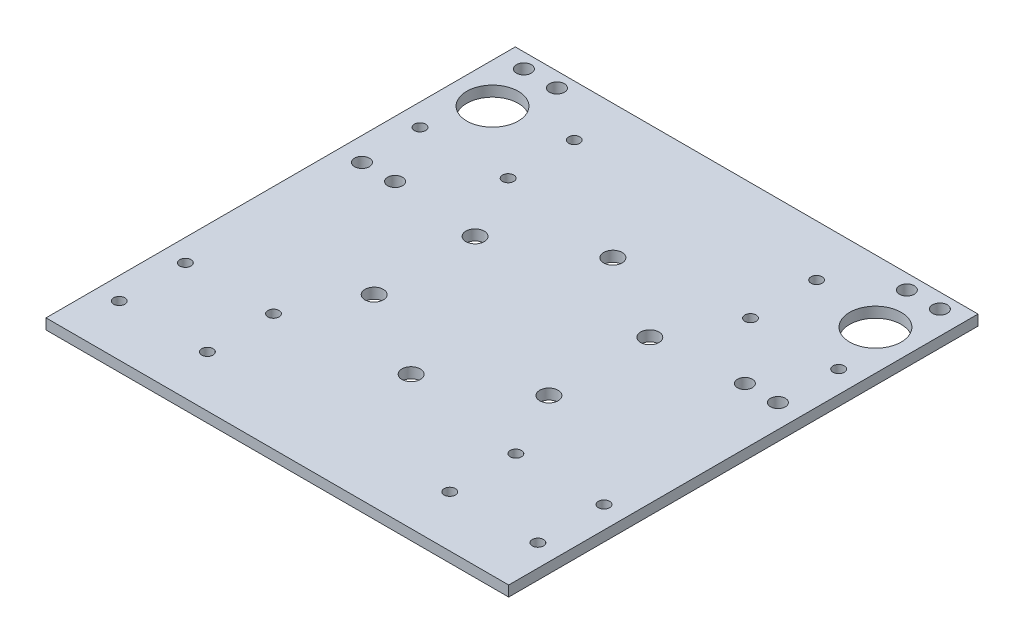
ISO-10303-21;
HEADER;
FILE_DESCRIPTION(('STEP AP214'),'2;1');
FILE_NAME('part.step','',(''),(''),'','','');
FILE_SCHEMA(('AUTOMOTIVE_DESIGN { 1 0 10303 214 1 1 1 1 }'));
ENDSEC;
DATA;
#1=APPLICATION_CONTEXT('core data for automotive mechanical design processes');
#2=APPLICATION_PROTOCOL_DEFINITION('international standard','automotive_design',2000,#1);
#3=PRODUCT_CONTEXT('',#1,'mechanical');
#4=PRODUCT('Part','Part','',(#3));
#5=PRODUCT_RELATED_PRODUCT_CATEGORY('part','',(#4));
#6=PRODUCT_DEFINITION_FORMATION('','',#4);
#7=PRODUCT_DEFINITION_CONTEXT('part definition',#1,'design');
#8=PRODUCT_DEFINITION('design','',#6,#7);
#9=PRODUCT_DEFINITION_SHAPE('','',#8);
#10=(LENGTH_UNIT() NAMED_UNIT(*) SI_UNIT(.MILLI.,.METRE.));
#11=(NAMED_UNIT(*) PLANE_ANGLE_UNIT() SI_UNIT($,.RADIAN.));
#12=(NAMED_UNIT(*) SI_UNIT($,.STERADIAN.) SOLID_ANGLE_UNIT());
#13=UNCERTAINTY_MEASURE_WITH_UNIT(LENGTH_MEASURE(1.E-05),#10,'distance_accuracy_value','');
#14=(GEOMETRIC_REPRESENTATION_CONTEXT(3) GLOBAL_UNCERTAINTY_ASSIGNED_CONTEXT((#13)) GLOBAL_UNIT_ASSIGNED_CONTEXT((#10,
#11,#12)) REPRESENTATION_CONTEXT('',''));
#15=CARTESIAN_POINT('',(0.,0.,0.));
#16=DIRECTION('',(0.,0.,1.));
#17=DIRECTION('',(1.,0.,0.));
#18=AXIS2_PLACEMENT_3D('',#15,#16,#17);
#19=CARTESIAN_POINT('',(0.,3.175,0.));
#20=DIRECTION('',(0.,-1.,0.));
#21=DIRECTION('',(0.,0.,-1.));
#22=AXIS2_PLACEMENT_3D('',#19,#20,#21);
#23=PLANE('',#22);
#24=CARTESIAN_POINT('',(-4.73926453636864E-12,3.175,30.525));
#25=DIRECTION('',(0.,1.,0.));
#26=DIRECTION('',(0.,0.,1.));
#27=AXIS2_PLACEMENT_3D('',#24,#25,#26);
#28=CIRCLE('',#27,2.778125);
#29=CARTESIAN_POINT('',(-4.73926453636864E-12,3.175,33.303125));
#30=VERTEX_POINT('',#29);
#31=EDGE_CURVE('E272',#30,#30,#28,.T.);
#32=ORIENTED_EDGE('',*,*,#31,.F.);
#33=EDGE_LOOP('',(#32));
#34=FACE_BOUND('',#33,.T.);
#35=CARTESIAN_POINT('',(26.4354254505184,3.175,15.2625000000027));
#36=DIRECTION('',(0.,1.,0.));
#37=DIRECTION('',(0.,0.,1.));
#38=AXIS2_PLACEMENT_3D('',#35,#36,#37);
#39=CIRCLE('',#38,2.778125);
#40=CARTESIAN_POINT('',(26.4354254505184,3.175,18.0406250000027));
#41=VERTEX_POINT('',#40);
#42=EDGE_CURVE('E279',#41,#41,#39,.T.);
#43=ORIENTED_EDGE('',*,*,#42,.F.);
#44=EDGE_LOOP('',(#43));
#45=FACE_BOUND('',#44,.T.);
#46=CARTESIAN_POINT('',(-26.4354254505232,3.175,15.2624999999945));
#47=DIRECTION('',(0.,1.,0.));
#48=DIRECTION('',(0.,0.,1.));
#49=AXIS2_PLACEMENT_3D('',#46,#47,#48);
#50=CIRCLE('',#49,2.778125);
#51=CARTESIAN_POINT('',(-26.4354254505232,3.175,18.0406249999945));
#52=VERTEX_POINT('',#51);
#53=EDGE_CURVE('E285',#52,#52,#50,.T.);
#54=ORIENTED_EDGE('',*,*,#53,.F.);
#55=EDGE_LOOP('',(#54));
#56=FACE_BOUND('',#55,.T.);
#57=CARTESIAN_POINT('',(26.4354254505208,3.175,-15.2624999999986));
#58=DIRECTION('',(0.,1.,0.));
#59=DIRECTION('',(0.,0.,1.));
#60=AXIS2_PLACEMENT_3D('',#57,#58,#59);
#61=CIRCLE('',#60,2.778125);
#62=CARTESIAN_POINT('',(26.4354254505208,3.175,-12.4843749999986));
#63=VERTEX_POINT('',#62);
#64=EDGE_CURVE('E291',#63,#63,#61,.T.);
#65=ORIENTED_EDGE('',*,*,#64,.F.);
#66=EDGE_LOOP('',(#65));
#67=FACE_BOUND('',#66,.T.);
#68=CARTESIAN_POINT('',(0.,3.175,-30.525));
#69=DIRECTION('',(0.,1.,0.));
#70=DIRECTION('',(0.,0.,1.));
#71=AXIS2_PLACEMENT_3D('',#68,#69,#70);
#72=CIRCLE('',#71,2.778125);
#73=CARTESIAN_POINT('',(0.,3.175,-27.746875));
#74=VERTEX_POINT('',#73);
#75=EDGE_CURVE('E271',#74,#74,#72,.T.);
#76=ORIENTED_EDGE('',*,*,#75,.F.);
#77=EDGE_LOOP('',(#76));
#78=FACE_BOUND('',#77,.T.);
#79=CARTESIAN_POINT('',(-26.435425450516,3.175,-15.2625000000069));
#80=DIRECTION('',(0.,1.,0.));
#81=DIRECTION('',(0.,0.,1.));
#82=AXIS2_PLACEMENT_3D('',#79,#80,#81);
#83=CIRCLE('',#82,2.778125);
#84=CARTESIAN_POINT('',(-26.435425450516,3.175,-12.4843750000069));
#85=VERTEX_POINT('',#84);
#86=EDGE_CURVE('E268',#85,#85,#83,.T.);
#87=ORIENTED_EDGE('',*,*,#86,.F.);
#88=EDGE_LOOP('',(#87));
#89=FACE_BOUND('',#88,.T.);
#90=CARTESIAN_POINT('',(62.9286,3.175,-17.5357));
#91=DIRECTION('',(0.,1.,0.));
#92=DIRECTION('',(0.,0.,1.));
#93=AXIS2_PLACEMENT_3D('',#90,#91,#92);
#94=CIRCLE('',#93,2.25);
#95=CARTESIAN_POINT('',(62.9286,3.175,-15.2857));
#96=VERTEX_POINT('',#95);
#97=EDGE_CURVE('E207',#96,#96,#94,.T.);
#98=ORIENTED_EDGE('',*,*,#97,.F.);
#99=EDGE_LOOP('',(#98));
#100=FACE_BOUND('',#99,.T.);
#101=CARTESIAN_POINT('',(36.6666666666667,3.175,-35.5));
#102=DIRECTION('',(0.,1.,0.));
#103=DIRECTION('',(0.,0.,1.));
#104=AXIS2_PLACEMENT_3D('',#101,#102,#103);
#105=CIRCLE('',#104,1.7);
#106=CARTESIAN_POINT('',(36.6666666666667,3.175,-33.8));
#107=VERTEX_POINT('',#106);
#108=EDGE_CURVE('E195',#107,#107,#105,.T.);
#109=ORIENTED_EDGE('',*,*,#108,.F.);
#110=EDGE_LOOP('',(#109));
#111=FACE_BOUND('',#110,.T.);
#112=CARTESIAN_POINT('',(-57.9286,3.175,-52.0357));
#113=DIRECTION('',(0.,1.,0.));
#114=DIRECTION('',(0.,0.,1.));
#115=AXIS2_PLACEMENT_3D('',#112,#113,#114);
#116=CIRCLE('',#115,7.8);
#117=CARTESIAN_POINT('',(-57.9286,3.175,-44.2357));
#118=VERTEX_POINT('',#117);
#119=EDGE_CURVE('E135',#118,#118,#116,.T.);
#120=ORIENTED_EDGE('',*,*,#119,.F.);
#121=EDGE_LOOP('',(#120));
#122=FACE_BOUND('',#121,.T.);
#123=CARTESIAN_POINT('',(-36.6666666666667,3.175,-55.5));
#124=DIRECTION('',(0.,1.,0.));
#125=DIRECTION('',(0.,0.,1.));
#126=AXIS2_PLACEMENT_3D('',#123,#124,#125);
#127=CIRCLE('',#126,1.7);
#128=CARTESIAN_POINT('',(-36.6666666666667,3.175,-53.8));
#129=VERTEX_POINT('',#128);
#130=EDGE_CURVE('E128',#129,#129,#127,.T.);
#131=ORIENTED_EDGE('',*,*,#130,.F.);
#132=EDGE_LOOP('',(#131));
#133=FACE_BOUND('',#132,.T.);
#134=CARTESIAN_POINT('',(52.9286,3.175,-66.5357));
#135=DIRECTION('',(0.,1.,0.));
#136=DIRECTION('',(0.,0.,1.));
#137=AXIS2_PLACEMENT_3D('',#134,#135,#136);
#138=CIRCLE('',#137,2.25);
#139=CARTESIAN_POINT('',(52.9286,3.175,-64.2857));
#140=VERTEX_POINT('',#139);
#141=EDGE_CURVE('E164',#140,#140,#138,.T.);
#142=ORIENTED_EDGE('',*,*,#141,.F.);
#143=EDGE_LOOP('',(#142));
#144=FACE_BOUND('',#143,.T.);
#145=CARTESIAN_POINT('',(-52.9286,3.175,-17.5357));
#146=DIRECTION('',(0.,1.,0.));
#147=DIRECTION('',(0.,0.,1.));
#148=AXIS2_PLACEMENT_3D('',#145,#146,#147);
#149=CIRCLE('',#148,2.25);
#150=CARTESIAN_POINT('',(-52.9286,3.175,-15.2857));
#151=VERTEX_POINT('',#150);
#152=EDGE_CURVE('E152',#151,#151,#149,.T.);
#153=ORIENTED_EDGE('',*,*,#152,.F.);
#154=EDGE_LOOP('',(#153));
#155=FACE_BOUND('',#154,.T.);
#156=CARTESIAN_POINT('',(-63.3333333333334,3.175,-35.5));
#157=DIRECTION('',(0.,1.,0.));
#158=DIRECTION('',(0.,0.,1.));
#159=AXIS2_PLACEMENT_3D('',#156,#157,#158);
#160=CIRCLE('',#159,1.7);
#161=CARTESIAN_POINT('',(-63.3333333333334,3.175,-33.8));
#162=VERTEX_POINT('',#161);
#163=EDGE_CURVE('E147',#162,#162,#160,.T.);
#164=ORIENTED_EDGE('',*,*,#163,.F.);
#165=EDGE_LOOP('',(#164));
#166=FACE_BOUND('',#165,.T.);
#167=CARTESIAN_POINT('',(63.3333333333334,3.175,35.5));
#168=DIRECTION('',(0.,1.,0.));
#169=DIRECTION('',(0.,0.,1.));
#170=AXIS2_PLACEMENT_3D('',#167,#168,#169);
#171=CIRCLE('',#170,1.7);
#172=CARTESIAN_POINT('',(63.3333333333334,3.175,37.2));
#173=VERTEX_POINT('',#172);
#174=EDGE_CURVE('E243',#173,#173,#171,.T.);
#175=ORIENTED_EDGE('',*,*,#174,.F.);
#176=EDGE_LOOP('',(#175));
#177=FACE_BOUND('',#176,.T.);
#178=CARTESIAN_POINT('',(36.6666666666667,3.175,55.5));
#179=DIRECTION('',(0.,1.,0.));
#180=DIRECTION('',(0.,0.,1.));
#181=AXIS2_PLACEMENT_3D('',#178,#179,#180);
#182=CIRCLE('',#181,1.7);
#183=CARTESIAN_POINT('',(36.6666666666667,3.175,57.2));
#184=VERTEX_POINT('',#183);
#185=EDGE_CURVE('E248',#184,#184,#182,.T.);
#186=ORIENTED_EDGE('',*,*,#185,.F.);
#187=EDGE_LOOP('',(#186));
#188=FACE_BOUND('',#187,.T.);
#189=CARTESIAN_POINT('',(-36.6666666666667,3.175,35.5));
#190=DIRECTION('',(0.,1.,0.));
#191=DIRECTION('',(0.,0.,1.));
#192=AXIS2_PLACEMENT_3D('',#189,#190,#191);
#193=CIRCLE('',#192,1.7);
#194=CARTESIAN_POINT('',(-36.6666666666667,3.175,37.2));
#195=VERTEX_POINT('',#194);
#196=EDGE_CURVE('E219',#195,#195,#193,.T.);
#197=ORIENTED_EDGE('',*,*,#196,.F.);
#198=EDGE_LOOP('',(#197));
#199=FACE_BOUND('',#198,.T.);
#200=CARTESIAN_POINT('',(-63.3333333333334,3.175,55.5));
#201=DIRECTION('',(0.,1.,0.));
#202=DIRECTION('',(0.,0.,1.));
#203=AXIS2_PLACEMENT_3D('',#200,#201,#202);
#204=CIRCLE('',#203,1.7);
#205=CARTESIAN_POINT('',(-63.3333333333334,3.175,57.2));
#206=VERTEX_POINT('',#205);
#207=EDGE_CURVE('E224',#206,#206,#204,.T.);
#208=ORIENTED_EDGE('',*,*,#207,.F.);
#209=EDGE_LOOP('',(#208));
#210=FACE_BOUND('',#209,.T.);
#211=CARTESIAN_POINT('',(-62.9286,3.175,-66.5357));
#212=DIRECTION('',(0.,1.,0.));
#213=DIRECTION('',(0.,0.,1.));
#214=AXIS2_PLACEMENT_3D('',#211,#212,#213);
#215=CIRCLE('',#214,2.25);
#216=CARTESIAN_POINT('',(-62.9286,3.175,-64.2857));
#217=VERTEX_POINT('',#216);
#218=EDGE_CURVE('E124',#217,#217,#215,.T.);
#219=ORIENTED_EDGE('',*,*,#218,.F.);
#220=EDGE_LOOP('',(#219));
#221=FACE_BOUND('',#220,.T.);
#222=DIRECTION('',(0.,0.,-1.));
#223=VECTOR('',#222,1.);
#224=CARTESIAN_POINT('',(70.,3.175,71.));
#225=LINE('',#224,#223);
#226=CARTESIAN_POINT('',(70.,3.175,71.));
#227=VERTEX_POINT('',#226);
#228=CARTESIAN_POINT('',(70.,3.175,-71.));
#229=VERTEX_POINT('',#228);
#230=EDGE_CURVE('E95',#227,#229,#225,.T.);
#231=ORIENTED_EDGE('',*,*,#230,.T.);
#232=DIRECTION('',(-1.,0.,0.));
#233=VECTOR('',#232,1.);
#234=CARTESIAN_POINT('',(-70.,3.175,-71.));
#235=LINE('',#234,#233);
#236=CARTESIAN_POINT('',(-70.,3.175,-71.));
#237=VERTEX_POINT('',#236);
#238=EDGE_CURVE('E90',#229,#237,#235,.T.);
#239=ORIENTED_EDGE('',*,*,#238,.T.);
#240=DIRECTION('',(0.,0.,1.));
#241=VECTOR('',#240,1.);
#242=CARTESIAN_POINT('',(-70.,3.175,71.));
#243=LINE('',#242,#241);
#244=CARTESIAN_POINT('',(-70.,3.175,71.));
#245=VERTEX_POINT('',#244);
#246=EDGE_CURVE('E93',#237,#245,#243,.T.);
#247=ORIENTED_EDGE('',*,*,#246,.T.);
#248=DIRECTION('',(1.,0.,0.));
#249=VECTOR('',#248,1.);
#250=CARTESIAN_POINT('',(-70.,3.175,71.));
#251=LINE('',#250,#249);
#252=EDGE_CURVE('E60',#245,#227,#251,.T.);
#253=ORIENTED_EDGE('',*,*,#252,.T.);
#254=EDGE_LOOP('',(#231,#239,#247,#253));
#255=FACE_BOUND('',#254,.T.);
#256=CARTESIAN_POINT('',(36.6666666666667,3.175,35.5));
#257=DIRECTION('',(0.,-1.,0.));
#258=DIRECTION('',(0.,0.,-1.));
#259=AXIS2_PLACEMENT_3D('',#256,#257,#258);
#260=CIRCLE('',#259,1.7);
#261=CARTESIAN_POINT('',(36.6666666666667,3.175,33.8));
#262=VERTEX_POINT('',#261);
#263=EDGE_CURVE('E236',#262,#262,#260,.T.);
#264=ORIENTED_EDGE('',*,*,#263,.T.);
#265=EDGE_LOOP('',(#264));
#266=FACE_BOUND('',#265,.T.);
#267=CARTESIAN_POINT('',(-36.6666666666667,3.175,55.5));
#268=DIRECTION('',(0.,-1.,0.));
#269=DIRECTION('',(0.,0.,-1.));
#270=AXIS2_PLACEMENT_3D('',#267,#268,#269);
#271=CIRCLE('',#270,1.7);
#272=CARTESIAN_POINT('',(-36.6666666666667,3.175,53.8));
#273=VERTEX_POINT('',#272);
#274=EDGE_CURVE('E231',#273,#273,#271,.T.);
#275=ORIENTED_EDGE('',*,*,#274,.T.);
#276=EDGE_LOOP('',(#275));
#277=FACE_BOUND('',#276,.T.);
#278=CARTESIAN_POINT('',(63.3333333333334,3.175,55.5));
#279=DIRECTION('',(0.,-1.,0.));
#280=DIRECTION('',(0.,0.,-1.));
#281=AXIS2_PLACEMENT_3D('',#278,#279,#280);
#282=CIRCLE('',#281,1.7);
#283=CARTESIAN_POINT('',(63.3333333333334,3.175,53.8));
#284=VERTEX_POINT('',#283);
#285=EDGE_CURVE('E255',#284,#284,#282,.T.);
#286=ORIENTED_EDGE('',*,*,#285,.T.);
#287=EDGE_LOOP('',(#286));
#288=FACE_BOUND('',#287,.T.);
#289=CARTESIAN_POINT('',(-62.9286,3.175,-17.5357));
#290=DIRECTION('',(0.,-1.,0.));
#291=DIRECTION('',(0.,0.,-1.));
#292=AXIS2_PLACEMENT_3D('',#289,#290,#291);
#293=CIRCLE('',#292,2.25);
#294=CARTESIAN_POINT('',(-62.9286,3.175,-19.7857));
#295=VERTEX_POINT('',#294);
#296=EDGE_CURVE('E159',#295,#295,#293,.T.);
#297=ORIENTED_EDGE('',*,*,#296,.T.);
#298=EDGE_LOOP('',(#297));
#299=FACE_BOUND('',#298,.T.);
#300=CARTESIAN_POINT('',(-52.9286,3.175,-66.5357));
#301=DIRECTION('',(0.,-1.,0.));
#302=DIRECTION('',(0.,0.,-1.));
#303=AXIS2_PLACEMENT_3D('',#300,#301,#302);
#304=CIRCLE('',#303,2.25);
#305=CARTESIAN_POINT('',(-52.9286,3.175,-68.7857));
#306=VERTEX_POINT('',#305);
#307=EDGE_CURVE('E127',#306,#306,#304,.T.);
#308=ORIENTED_EDGE('',*,*,#307,.T.);
#309=EDGE_LOOP('',(#308));
#310=FACE_BOUND('',#309,.T.);
#311=CARTESIAN_POINT('',(-36.6666666666667,3.175,-35.5));
#312=DIRECTION('',(0.,-1.,0.));
#313=DIRECTION('',(0.,0.,-1.));
#314=AXIS2_PLACEMENT_3D('',#311,#312,#313);
#315=CIRCLE('',#314,1.7);
#316=CARTESIAN_POINT('',(-36.6666666666667,3.175,-37.2));
#317=VERTEX_POINT('',#316);
#318=EDGE_CURVE('E140',#317,#317,#315,.T.);
#319=ORIENTED_EDGE('',*,*,#318,.T.);
#320=EDGE_LOOP('',(#319));
#321=FACE_BOUND('',#320,.T.);
#322=CARTESIAN_POINT('',(52.9286,3.175,-17.5357));
#323=DIRECTION('',(0.,-1.,0.));
#324=DIRECTION('',(0.,0.,-1.));
#325=AXIS2_PLACEMENT_3D('',#322,#323,#324);
#326=CIRCLE('',#325,2.25);
#327=CARTESIAN_POINT('',(52.9286,3.175,-19.7857));
#328=VERTEX_POINT('',#327);
#329=EDGE_CURVE('E200',#328,#328,#326,.T.);
#330=ORIENTED_EDGE('',*,*,#329,.T.);
#331=EDGE_LOOP('',(#330));
#332=FACE_BOUND('',#331,.T.);
#333=CARTESIAN_POINT('',(-63.3333333333334,3.175,35.5));
#334=DIRECTION('',(0.,-1.,0.));
#335=DIRECTION('',(0.,0.,-1.));
#336=AXIS2_PLACEMENT_3D('',#333,#334,#335);
#337=CIRCLE('',#336,1.7);
#338=CARTESIAN_POINT('',(-63.3333333333334,3.175,33.8));
#339=VERTEX_POINT('',#338);
#340=EDGE_CURVE('E212',#339,#339,#337,.T.);
#341=ORIENTED_EDGE('',*,*,#340,.T.);
#342=EDGE_LOOP('',(#341));
#343=FACE_BOUND('',#342,.T.);
#344=CARTESIAN_POINT('',(62.9286,3.175,-66.5357));
#345=DIRECTION('',(0.,-1.,0.));
#346=DIRECTION('',(0.,0.,-1.));
#347=AXIS2_PLACEMENT_3D('',#344,#345,#346);
#348=CIRCLE('',#347,2.25);
#349=CARTESIAN_POINT('',(62.9286,3.175,-68.7857));
#350=VERTEX_POINT('',#349);
#351=EDGE_CURVE('E171',#350,#350,#348,.T.);
#352=ORIENTED_EDGE('',*,*,#351,.T.);
#353=EDGE_LOOP('',(#352));
#354=FACE_BOUND('',#353,.T.);
#355=CARTESIAN_POINT('',(36.6666666666667,3.175,-55.5));
#356=DIRECTION('',(0.,-1.,0.));
#357=DIRECTION('',(0.,0.,-1.));
#358=AXIS2_PLACEMENT_3D('',#355,#356,#357);
#359=CIRCLE('',#358,1.7);
#360=CARTESIAN_POINT('',(36.6666666666667,3.175,-57.2));
#361=VERTEX_POINT('',#360);
#362=EDGE_CURVE('E176',#361,#361,#359,.T.);
#363=ORIENTED_EDGE('',*,*,#362,.T.);
#364=EDGE_LOOP('',(#363));
#365=FACE_BOUND('',#364,.T.);
#366=CARTESIAN_POINT('',(57.9286,3.175,-52.0357));
#367=DIRECTION('',(0.,-1.,0.));
#368=DIRECTION('',(0.,0.,-1.));
#369=AXIS2_PLACEMENT_3D('',#366,#367,#368);
#370=CIRCLE('',#369,7.79999999999999);
#371=CARTESIAN_POINT('',(57.9286,3.175,-59.8357));
#372=VERTEX_POINT('',#371);
#373=EDGE_CURVE('E183',#372,#372,#370,.T.);
#374=ORIENTED_EDGE('',*,*,#373,.T.);
#375=EDGE_LOOP('',(#374));
#376=FACE_BOUND('',#375,.T.);
#377=CARTESIAN_POINT('',(63.3333333333334,3.175,-35.5));
#378=DIRECTION('',(0.,-1.,0.));
#379=DIRECTION('',(0.,0.,-1.));
#380=AXIS2_PLACEMENT_3D('',#377,#378,#379);
#381=CIRCLE('',#380,1.7);
#382=CARTESIAN_POINT('',(63.3333333333334,3.175,-37.2));
#383=VERTEX_POINT('',#382);
#384=EDGE_CURVE('E188',#383,#383,#381,.T.);
#385=ORIENTED_EDGE('',*,*,#384,.T.);
#386=EDGE_LOOP('',(#385));
#387=FACE_BOUND('',#386,.T.);
#388=ADVANCED_FACE('F43',(#34,#45,#56,#67,#78,#89,#100,#111,#122,#133,#144,#155,#166,#177,#188,
#199,#210,#221,#255,#266,#277,#288,#299,#310,#321,#332,#343,#354,#365,#376,#387),#23,.F.);
#389=CARTESIAN_POINT('',(0.,0.,0.));
#390=DIRECTION('',(0.,-1.,0.));
#391=DIRECTION('',(0.,0.,-1.));
#392=AXIS2_PLACEMENT_3D('',#389,#390,#391);
#393=PLANE('',#392);
#394=CARTESIAN_POINT('',(-4.73926453636864E-12,0.,30.525));
#395=DIRECTION('',(0.,-1.,0.));
#396=DIRECTION('',(0.,0.,-1.));
#397=AXIS2_PLACEMENT_3D('',#394,#395,#396);
#398=CIRCLE('',#397,2.778125);
#399=CARTESIAN_POINT('',(-4.73926453636864E-12,0.,27.746875));
#400=VERTEX_POINT('',#399);
#401=EDGE_CURVE('E276',#400,#400,#398,.F.);
#402=ORIENTED_EDGE('',*,*,#401,.T.);
#403=EDGE_LOOP('',(#402));
#404=FACE_BOUND('',#403,.T.);
#405=CARTESIAN_POINT('',(26.4354254505184,0.,15.2625000000027));
#406=DIRECTION('',(0.,-1.,0.));
#407=DIRECTION('',(0.,0.,-1.));
#408=AXIS2_PLACEMENT_3D('',#405,#406,#407);
#409=CIRCLE('',#408,2.778125);
#410=CARTESIAN_POINT('',(26.4354254505184,0.,12.4843750000027));
#411=VERTEX_POINT('',#410);
#412=EDGE_CURVE('E275',#411,#411,#409,.F.);
#413=ORIENTED_EDGE('',*,*,#412,.T.);
#414=EDGE_LOOP('',(#413));
#415=FACE_BOUND('',#414,.T.);
#416=CARTESIAN_POINT('',(-26.4354254505232,0.,15.2624999999945));
#417=DIRECTION('',(0.,-1.,0.));
#418=DIRECTION('',(0.,0.,-1.));
#419=AXIS2_PLACEMENT_3D('',#416,#417,#418);
#420=CIRCLE('',#419,2.778125);
#421=CARTESIAN_POINT('',(-26.4354254505232,0.,12.4843749999945));
#422=VERTEX_POINT('',#421);
#423=EDGE_CURVE('E282',#422,#422,#420,.F.);
#424=ORIENTED_EDGE('',*,*,#423,.T.);
#425=EDGE_LOOP('',(#424));
#426=FACE_BOUND('',#425,.T.);
#427=CARTESIAN_POINT('',(26.4354254505208,0.,-15.2624999999986));
#428=DIRECTION('',(0.,-1.,0.));
#429=DIRECTION('',(0.,0.,-1.));
#430=AXIS2_PLACEMENT_3D('',#427,#428,#429);
#431=CIRCLE('',#430,2.778125);
#432=CARTESIAN_POINT('',(26.4354254505208,0.,-18.0406249999986));
#433=VERTEX_POINT('',#432);
#434=EDGE_CURVE('E288',#433,#433,#431,.F.);
#435=ORIENTED_EDGE('',*,*,#434,.T.);
#436=EDGE_LOOP('',(#435));
#437=FACE_BOUND('',#436,.T.);
#438=CARTESIAN_POINT('',(0.,0.,-30.525));
#439=DIRECTION('',(0.,-1.,0.));
#440=DIRECTION('',(0.,0.,-1.));
#441=AXIS2_PLACEMENT_3D('',#438,#439,#440);
#442=CIRCLE('',#441,2.778125);
#443=CARTESIAN_POINT('',(0.,0.,-33.303125));
#444=VERTEX_POINT('',#443);
#445=EDGE_CURVE('E294',#444,#444,#442,.F.);
#446=ORIENTED_EDGE('',*,*,#445,.T.);
#447=EDGE_LOOP('',(#446));
#448=FACE_BOUND('',#447,.T.);
#449=CARTESIAN_POINT('',(-26.435425450516,0.,-15.2625000000069));
#450=DIRECTION('',(0.,-1.,0.));
#451=DIRECTION('',(0.,0.,-1.));
#452=AXIS2_PLACEMENT_3D('',#449,#450,#451);
#453=CIRCLE('',#452,2.778125);
#454=CARTESIAN_POINT('',(-26.435425450516,0.,-18.0406250000069));
#455=VERTEX_POINT('',#454);
#456=EDGE_CURVE('E265',#455,#455,#453,.F.);
#457=ORIENTED_EDGE('',*,*,#456,.T.);
#458=EDGE_LOOP('',(#457));
#459=FACE_BOUND('',#458,.T.);
#460=CARTESIAN_POINT('',(57.9286,0.,-52.0357));
#461=DIRECTION('',(0.,-1.,0.));
#462=DIRECTION('',(0.,0.,-1.));
#463=AXIS2_PLACEMENT_3D('',#460,#461,#462);
#464=CIRCLE('',#463,7.79999999999999);
#465=CARTESIAN_POINT('',(57.9286,0.,-59.8357));
#466=VERTEX_POINT('',#465);
#467=EDGE_CURVE('E191',#466,#466,#464,.T.);
#468=ORIENTED_EDGE('',*,*,#467,.F.);
#469=EDGE_LOOP('',(#468));
#470=FACE_BOUND('',#469,.T.);
#471=CARTESIAN_POINT('',(62.9286,0.,-66.5357));
#472=DIRECTION('',(0.,-1.,0.));
#473=DIRECTION('',(0.,0.,-1.));
#474=AXIS2_PLACEMENT_3D('',#471,#472,#473);
#475=CIRCLE('',#474,2.25);
#476=CARTESIAN_POINT('',(62.9286,0.,-68.7857));
#477=VERTEX_POINT('',#476);
#478=EDGE_CURVE('E179',#477,#477,#475,.T.);
#479=ORIENTED_EDGE('',*,*,#478,.F.);
#480=EDGE_LOOP('',(#479));
#481=FACE_BOUND('',#480,.T.);
#482=CARTESIAN_POINT('',(52.9286,0.,-17.5357));
#483=DIRECTION('',(0.,-1.,0.));
#484=DIRECTION('',(0.,0.,-1.));
#485=AXIS2_PLACEMENT_3D('',#482,#483,#484);
#486=CIRCLE('',#485,2.25);
#487=CARTESIAN_POINT('',(52.9286,0.,-19.7857));
#488=VERTEX_POINT('',#487);
#489=EDGE_CURVE('E204',#488,#488,#486,.T.);
#490=ORIENTED_EDGE('',*,*,#489,.F.);
#491=EDGE_LOOP('',(#490));
#492=FACE_BOUND('',#491,.T.);
#493=CARTESIAN_POINT('',(36.6666666666667,0.,-35.5));
#494=DIRECTION('',(0.,-1.,0.));
#495=DIRECTION('',(0.,0.,-1.));
#496=AXIS2_PLACEMENT_3D('',#493,#494,#495);
#497=CIRCLE('',#496,1.7);
#498=CARTESIAN_POINT('',(36.6666666666667,0.,-37.2));
#499=VERTEX_POINT('',#498);
#500=EDGE_CURVE('E203',#499,#499,#497,.F.);
#501=ORIENTED_EDGE('',*,*,#500,.T.);
#502=EDGE_LOOP('',(#501));
#503=FACE_BOUND('',#502,.T.);
#504=CARTESIAN_POINT('',(-52.9286,0.,-66.5357));
#505=DIRECTION('',(0.,-1.,0.));
#506=DIRECTION('',(0.,0.,-1.));
#507=AXIS2_PLACEMENT_3D('',#504,#505,#506);
#508=CIRCLE('',#507,2.25);
#509=CARTESIAN_POINT('',(-52.9286,0.,-68.7857));
#510=VERTEX_POINT('',#509);
#511=EDGE_CURVE('E131',#510,#510,#508,.T.);
#512=ORIENTED_EDGE('',*,*,#511,.F.);
#513=EDGE_LOOP('',(#512));
#514=FACE_BOUND('',#513,.T.);
#515=CARTESIAN_POINT('',(52.9286,0.,-66.5357));
#516=DIRECTION('',(0.,-1.,0.));
#517=DIRECTION('',(0.,0.,-1.));
#518=AXIS2_PLACEMENT_3D('',#515,#516,#517);
#519=CIRCLE('',#518,2.25);
#520=CARTESIAN_POINT('',(52.9286,0.,-68.7857));
#521=VERTEX_POINT('',#520);
#522=EDGE_CURVE('E168',#521,#521,#519,.F.);
#523=ORIENTED_EDGE('',*,*,#522,.T.);
#524=EDGE_LOOP('',(#523));
#525=FACE_BOUND('',#524,.T.);
#526=CARTESIAN_POINT('',(63.3333333333334,0.,55.5));
#527=DIRECTION('',(0.,-1.,0.));
#528=DIRECTION('',(0.,0.,-1.));
#529=AXIS2_PLACEMENT_3D('',#526,#527,#528);
#530=CIRCLE('',#529,1.7);
#531=CARTESIAN_POINT('',(63.3333333333334,0.,53.8));
#532=VERTEX_POINT('',#531);
#533=EDGE_CURVE('E262',#532,#532,#530,.T.);
#534=ORIENTED_EDGE('',*,*,#533,.F.);
#535=EDGE_LOOP('',(#534));
#536=FACE_BOUND('',#535,.T.);
#537=CARTESIAN_POINT('',(-36.6666666666667,0.,35.5));
#538=DIRECTION('',(0.,-1.,0.));
#539=DIRECTION('',(0.,0.,-1.));
#540=AXIS2_PLACEMENT_3D('',#537,#538,#539);
#541=CIRCLE('',#540,1.7);
#542=CARTESIAN_POINT('',(-36.6666666666667,0.,33.8));
#543=VERTEX_POINT('',#542);
#544=EDGE_CURVE('E227',#543,#543,#541,.F.);
#545=ORIENTED_EDGE('',*,*,#544,.T.);
#546=EDGE_LOOP('',(#545));
#547=FACE_BOUND('',#546,.T.);
#548=CARTESIAN_POINT('',(-63.3333333333334,0.,55.5));
#549=DIRECTION('',(0.,-1.,0.));
#550=DIRECTION('',(0.,0.,-1.));
#551=AXIS2_PLACEMENT_3D('',#548,#549,#550);
#552=CIRCLE('',#551,1.7);
#553=CARTESIAN_POINT('',(-63.3333333333334,0.,53.8));
#554=VERTEX_POINT('',#553);
#555=EDGE_CURVE('E228',#554,#554,#552,.F.);
#556=ORIENTED_EDGE('',*,*,#555,.T.);
#557=EDGE_LOOP('',(#556));
#558=FACE_BOUND('',#557,.T.);
#559=CARTESIAN_POINT('',(36.6666666666667,0.,35.5));
#560=DIRECTION('',(0.,-1.,0.));
#561=DIRECTION('',(0.,0.,-1.));
#562=AXIS2_PLACEMENT_3D('',#559,#560,#561);
#563=CIRCLE('',#562,1.7);
#564=CARTESIAN_POINT('',(36.6666666666667,0.,33.8));
#565=VERTEX_POINT('',#564);
#566=EDGE_CURVE('E240',#565,#565,#563,.T.);
#567=ORIENTED_EDGE('',*,*,#566,.F.);
#568=EDGE_LOOP('',(#567));
#569=FACE_BOUND('',#568,.T.);
#570=CARTESIAN_POINT('',(-62.9286,0.,-66.5357));
#571=DIRECTION('',(0.,-1.,0.));
#572=DIRECTION('',(0.,0.,-1.));
#573=AXIS2_PLACEMENT_3D('',#570,#571,#572);
#574=CIRCLE('',#573,2.25);
#575=CARTESIAN_POINT('',(-62.9286,0.,-68.7857));
#576=VERTEX_POINT('',#575);
#577=EDGE_CURVE('E110',#576,#576,#574,.F.);
#578=ORIENTED_EDGE('',*,*,#577,.T.);
#579=EDGE_LOOP('',(#578));
#580=FACE_BOUND('',#579,.T.);
#581=DIRECTION('',(0.,0.,-1.));
#582=VECTOR('',#581,1.);
#583=CARTESIAN_POINT('',(70.,0.,71.));
#584=LINE('',#583,#582);
#585=CARTESIAN_POINT('',(70.,0.,71.));
#586=VERTEX_POINT('',#585);
#587=CARTESIAN_POINT('',(70.,0.,-71.));
#588=VERTEX_POINT('',#587);
#589=EDGE_CURVE('E107',#586,#588,#584,.T.);
#590=ORIENTED_EDGE('',*,*,#589,.F.);
#591=DIRECTION('',(1.,0.,0.));
#592=VECTOR('',#591,1.);
#593=CARTESIAN_POINT('',(-70.,0.,71.));
#594=LINE('',#593,#592);
#595=CARTESIAN_POINT('',(-70.,0.,71.));
#596=VERTEX_POINT('',#595);
#597=EDGE_CURVE('E83',#596,#586,#594,.T.);
#598=ORIENTED_EDGE('',*,*,#597,.F.);
#599=DIRECTION('',(0.,0.,1.));
#600=VECTOR('',#599,1.);
#601=CARTESIAN_POINT('',(-70.,0.,71.));
#602=LINE('',#601,#600);
#603=CARTESIAN_POINT('',(-70.,0.,-71.));
#604=VERTEX_POINT('',#603);
#605=EDGE_CURVE('E77',#604,#596,#602,.T.);
#606=ORIENTED_EDGE('',*,*,#605,.F.);
#607=DIRECTION('',(-1.,0.,0.));
#608=VECTOR('',#607,1.);
#609=CARTESIAN_POINT('',(-70.,0.,-71.));
#610=LINE('',#609,#608);
#611=EDGE_CURVE('E99',#588,#604,#610,.T.);
#612=ORIENTED_EDGE('',*,*,#611,.F.);
#613=EDGE_LOOP('',(#590,#598,#606,#612));
#614=FACE_BOUND('',#613,.T.);
#615=CARTESIAN_POINT('',(-36.6666666666667,0.,55.5));
#616=DIRECTION('',(0.,-1.,0.));
#617=DIRECTION('',(0.,0.,-1.));
#618=AXIS2_PLACEMENT_3D('',#615,#616,#617);
#619=CIRCLE('',#618,1.7);
#620=CARTESIAN_POINT('',(-36.6666666666667,0.,53.8));
#621=VERTEX_POINT('',#620);
#622=EDGE_CURVE('E239',#621,#621,#619,.T.);
#623=ORIENTED_EDGE('',*,*,#622,.F.);
#624=EDGE_LOOP('',(#623));
#625=FACE_BOUND('',#624,.T.);
#626=CARTESIAN_POINT('',(36.6666666666667,0.,55.5));
#627=DIRECTION('',(0.,-1.,0.));
#628=DIRECTION('',(0.,0.,-1.));
#629=AXIS2_PLACEMENT_3D('',#626,#627,#628);
#630=CIRCLE('',#629,1.7);
#631=CARTESIAN_POINT('',(36.6666666666667,0.,53.8));
#632=VERTEX_POINT('',#631);
#633=EDGE_CURVE('E252',#632,#632,#630,.F.);
#634=ORIENTED_EDGE('',*,*,#633,.T.);
#635=EDGE_LOOP('',(#634));
#636=FACE_BOUND('',#635,.T.);
#637=CARTESIAN_POINT('',(63.3333333333334,0.,35.5));
#638=DIRECTION('',(0.,-1.,0.));
#639=DIRECTION('',(0.,0.,-1.));
#640=AXIS2_PLACEMENT_3D('',#637,#638,#639);
#641=CIRCLE('',#640,1.7);
#642=CARTESIAN_POINT('',(63.3333333333334,0.,33.8));
#643=VERTEX_POINT('',#642);
#644=EDGE_CURVE('E251',#643,#643,#641,.F.);
#645=ORIENTED_EDGE('',*,*,#644,.T.);
#646=EDGE_LOOP('',(#645));
#647=FACE_BOUND('',#646,.T.);
#648=CARTESIAN_POINT('',(-63.3333333333334,0.,-35.5));
#649=DIRECTION('',(0.,-1.,0.));
#650=DIRECTION('',(0.,0.,-1.));
#651=AXIS2_PLACEMENT_3D('',#648,#649,#650);
#652=CIRCLE('',#651,1.7);
#653=CARTESIAN_POINT('',(-63.3333333333334,0.,-37.2));
#654=VERTEX_POINT('',#653);
#655=EDGE_CURVE('E155',#654,#654,#652,.F.);
#656=ORIENTED_EDGE('',*,*,#655,.T.);
#657=EDGE_LOOP('',(#656));
#658=FACE_BOUND('',#657,.T.);
#659=CARTESIAN_POINT('',(-52.9286,0.,-17.5357));
#660=DIRECTION('',(0.,-1.,0.));
#661=DIRECTION('',(0.,0.,-1.));
#662=AXIS2_PLACEMENT_3D('',#659,#660,#661);
#663=CIRCLE('',#662,2.25);
#664=CARTESIAN_POINT('',(-52.9286,0.,-19.7857));
#665=VERTEX_POINT('',#664);
#666=EDGE_CURVE('E156',#665,#665,#663,.F.);
#667=ORIENTED_EDGE('',*,*,#666,.T.);
#668=EDGE_LOOP('',(#667));
#669=FACE_BOUND('',#668,.T.);
#670=CARTESIAN_POINT('',(-62.9286,0.,-17.5357));
#671=DIRECTION('',(0.,-1.,0.));
#672=DIRECTION('',(0.,0.,-1.));
#673=AXIS2_PLACEMENT_3D('',#670,#671,#672);
#674=CIRCLE('',#673,2.25);
#675=CARTESIAN_POINT('',(-62.9286,0.,-19.7857));
#676=VERTEX_POINT('',#675);
#677=EDGE_CURVE('E167',#676,#676,#674,.T.);
#678=ORIENTED_EDGE('',*,*,#677,.F.);
#679=EDGE_LOOP('',(#678));
#680=FACE_BOUND('',#679,.T.);
#681=CARTESIAN_POINT('',(-36.6666666666667,0.,-55.5));
#682=DIRECTION('',(0.,-1.,0.));
#683=DIRECTION('',(0.,0.,-1.));
#684=AXIS2_PLACEMENT_3D('',#681,#682,#683);
#685=CIRCLE('',#684,1.7);
#686=CARTESIAN_POINT('',(-36.6666666666667,0.,-57.2));
#687=VERTEX_POINT('',#686);
#688=EDGE_CURVE('E132',#687,#687,#685,.F.);
#689=ORIENTED_EDGE('',*,*,#688,.T.);
#690=EDGE_LOOP('',(#689));
#691=FACE_BOUND('',#690,.T.);
#692=CARTESIAN_POINT('',(-57.9286,0.,-52.0357));
#693=DIRECTION('',(0.,-1.,0.));
#694=DIRECTION('',(0.,0.,-1.));
#695=AXIS2_PLACEMENT_3D('',#692,#693,#694);
#696=CIRCLE('',#695,7.8);
#697=CARTESIAN_POINT('',(-57.9286,0.,-59.8357));
#698=VERTEX_POINT('',#697);
#699=EDGE_CURVE('E143',#698,#698,#696,.F.);
#700=ORIENTED_EDGE('',*,*,#699,.T.);
#701=EDGE_LOOP('',(#700));
#702=FACE_BOUND('',#701,.T.);
#703=CARTESIAN_POINT('',(-36.6666666666667,0.,-35.5));
#704=DIRECTION('',(0.,-1.,0.));
#705=DIRECTION('',(0.,0.,-1.));
#706=AXIS2_PLACEMENT_3D('',#703,#704,#705);
#707=CIRCLE('',#706,1.7);
#708=CARTESIAN_POINT('',(-36.6666666666667,0.,-37.2));
#709=VERTEX_POINT('',#708);
#710=EDGE_CURVE('E144',#709,#709,#707,.T.);
#711=ORIENTED_EDGE('',*,*,#710,.F.);
#712=EDGE_LOOP('',(#711));
#713=FACE_BOUND('',#712,.T.);
#714=CARTESIAN_POINT('',(62.9286,0.,-17.5357));
#715=DIRECTION('',(0.,-1.,0.));
#716=DIRECTION('',(0.,0.,-1.));
#717=AXIS2_PLACEMENT_3D('',#714,#715,#716);
#718=CIRCLE('',#717,2.25);
#719=CARTESIAN_POINT('',(62.9286,0.,-19.7857));
#720=VERTEX_POINT('',#719);
#721=EDGE_CURVE('E215',#720,#720,#718,.F.);
#722=ORIENTED_EDGE('',*,*,#721,.T.);
#723=EDGE_LOOP('',(#722));
#724=FACE_BOUND('',#723,.T.);
#725=CARTESIAN_POINT('',(-63.3333333333334,0.,35.5));
#726=DIRECTION('',(0.,-1.,0.));
#727=DIRECTION('',(0.,0.,-1.));
#728=AXIS2_PLACEMENT_3D('',#725,#726,#727);
#729=CIRCLE('',#728,1.7);
#730=CARTESIAN_POINT('',(-63.3333333333334,0.,33.8));
#731=VERTEX_POINT('',#730);
#732=EDGE_CURVE('E216',#731,#731,#729,.T.);
#733=ORIENTED_EDGE('',*,*,#732,.F.);
#734=EDGE_LOOP('',(#733));
#735=FACE_BOUND('',#734,.T.);
#736=CARTESIAN_POINT('',(36.6666666666667,0.,-55.5));
#737=DIRECTION('',(0.,-1.,0.));
#738=DIRECTION('',(0.,0.,-1.));
#739=AXIS2_PLACEMENT_3D('',#736,#737,#738);
#740=CIRCLE('',#739,1.7);
#741=CARTESIAN_POINT('',(36.6666666666667,0.,-57.2));
#742=VERTEX_POINT('',#741);
#743=EDGE_CURVE('E180',#742,#742,#740,.T.);
#744=ORIENTED_EDGE('',*,*,#743,.F.);
#745=EDGE_LOOP('',(#744));
#746=FACE_BOUND('',#745,.T.);
#747=CARTESIAN_POINT('',(63.3333333333334,0.,-35.5));
#748=DIRECTION('',(0.,-1.,0.));
#749=DIRECTION('',(0.,0.,-1.));
#750=AXIS2_PLACEMENT_3D('',#747,#748,#749);
#751=CIRCLE('',#750,1.7);
#752=CARTESIAN_POINT('',(63.3333333333334,0.,-37.2));
#753=VERTEX_POINT('',#752);
#754=EDGE_CURVE('E192',#753,#753,#751,.T.);
#755=ORIENTED_EDGE('',*,*,#754,.F.);
#756=EDGE_LOOP('',(#755));
#757=FACE_BOUND('',#756,.T.);
#758=ADVANCED_FACE('F118',(#404,#415,#426,#437,#448,#459,#470,#481,#492,#503,#514,#525,#536,
#547,#558,#569,#580,#614,#625,#636,#647,#658,#669,#680,#691,#702,#713,#724,#735,#746,#757),#393,.T.);
#759=CARTESIAN_POINT('',(70.,3.175,71.));
#760=DIRECTION('',(-1.,0.,0.));
#761=DIRECTION('',(0.,0.,1.));
#762=AXIS2_PLACEMENT_3D('',#759,#760,#761);
#763=PLANE('',#762);
#764=ORIENTED_EDGE('',*,*,#589,.T.);
#765=DIRECTION('',(0.,-1.,0.));
#766=VECTOR('',#765,1.);
#767=CARTESIAN_POINT('',(70.,3.175,-71.));
#768=LINE('',#767,#766);
#769=EDGE_CURVE('E11',#229,#588,#768,.T.);
#770=ORIENTED_EDGE('',*,*,#769,.F.);
#771=ORIENTED_EDGE('',*,*,#230,.F.);
#772=DIRECTION('',(0.,-1.,0.));
#773=VECTOR('',#772,1.);
#774=CARTESIAN_POINT('',(70.,3.175,71.));
#775=LINE('',#774,#773);
#776=EDGE_CURVE('E103',#227,#586,#775,.T.);
#777=ORIENTED_EDGE('',*,*,#776,.T.);
#778=EDGE_LOOP('',(#764,#770,#771,#777));
#779=FACE_BOUND('',#778,.T.);
#780=ADVANCED_FACE('F45',(#779),#763,.F.);
#781=CARTESIAN_POINT('',(-70.,3.175,-71.));
#782=DIRECTION('',(0.,0.,1.));
#783=DIRECTION('',(1.,0.,0.));
#784=AXIS2_PLACEMENT_3D('',#781,#782,#783);
#785=PLANE('',#784);
#786=ORIENTED_EDGE('',*,*,#611,.T.);
#787=DIRECTION('',(0.,-1.,0.));
#788=VECTOR('',#787,1.);
#789=CARTESIAN_POINT('',(-70.,3.175,-71.));
#790=LINE('',#789,#788);
#791=EDGE_CURVE('E52',#237,#604,#790,.T.);
#792=ORIENTED_EDGE('',*,*,#791,.F.);
#793=ORIENTED_EDGE('',*,*,#238,.F.);
#794=ORIENTED_EDGE('',*,*,#769,.T.);
#795=EDGE_LOOP('',(#786,#792,#793,#794));
#796=FACE_BOUND('',#795,.T.);
#797=ADVANCED_FACE('F98',(#796),#785,.F.);
#798=CARTESIAN_POINT('',(-70.,3.175,71.));
#799=DIRECTION('',(1.,0.,0.));
#800=DIRECTION('',(0.,0.,-1.));
#801=AXIS2_PLACEMENT_3D('',#798,#799,#800);
#802=PLANE('',#801);
#803=ORIENTED_EDGE('',*,*,#605,.T.);
#804=DIRECTION('',(0.,-1.,0.));
#805=VECTOR('',#804,1.);
#806=CARTESIAN_POINT('',(-70.,3.175,71.));
#807=LINE('',#806,#805);
#808=EDGE_CURVE('E100',#245,#596,#807,.T.);
#809=ORIENTED_EDGE('',*,*,#808,.F.);
#810=ORIENTED_EDGE('',*,*,#246,.F.);
#811=ORIENTED_EDGE('',*,*,#791,.T.);
#812=EDGE_LOOP('',(#803,#809,#810,#811));
#813=FACE_BOUND('',#812,.T.);
#814=ADVANCED_FACE('F101',(#813),#802,.F.);
#815=CARTESIAN_POINT('',(-70.,3.175,71.));
#816=DIRECTION('',(0.,0.,-1.));
#817=DIRECTION('',(-1.,0.,0.));
#818=AXIS2_PLACEMENT_3D('',#815,#816,#817);
#819=PLANE('',#818);
#820=ORIENTED_EDGE('',*,*,#597,.T.);
#821=ORIENTED_EDGE('',*,*,#776,.F.);
#822=ORIENTED_EDGE('',*,*,#252,.F.);
#823=ORIENTED_EDGE('',*,*,#808,.T.);
#824=EDGE_LOOP('',(#820,#821,#822,#823));
#825=FACE_BOUND('',#824,.T.);
#826=ADVANCED_FACE('F115',(#825),#819,.F.);
#827=CARTESIAN_POINT('',(-62.9286,-22.0617315730203,-66.5357));
#828=DIRECTION('',(0.,1.,0.));
#829=DIRECTION('',(0.,0.,1.));
#830=AXIS2_PLACEMENT_3D('',#827,#828,#829);
#831=CYLINDRICAL_SURFACE('',#830,2.25);
#832=ORIENTED_EDGE('',*,*,#218,.T.);
#833=EDGE_LOOP('',(#832));
#834=FACE_BOUND('',#833,.T.);
#835=ORIENTED_EDGE('',*,*,#577,.F.);
#836=EDGE_LOOP('',(#835));
#837=FACE_BOUND('',#836,.T.);
#838=ADVANCED_FACE('F332',(#834,#837),#831,.F.);
#839=CARTESIAN_POINT('',(36.6666666666667,-22.0617315730203,35.5));
#840=DIRECTION('',(0.,1.,0.));
#841=DIRECTION('',(0.,0.,1.));
#842=AXIS2_PLACEMENT_3D('',#839,#840,#841);
#843=CYLINDRICAL_SURFACE('',#842,1.7);
#844=ORIENTED_EDGE('',*,*,#263,.F.);
#845=EDGE_LOOP('',(#844));
#846=FACE_BOUND('',#845,.T.);
#847=ORIENTED_EDGE('',*,*,#566,.T.);
#848=EDGE_LOOP('',(#847));
#849=FACE_BOUND('',#848,.T.);
#850=ADVANCED_FACE('F380',(#846,#849),#843,.F.);
#851=CARTESIAN_POINT('',(-36.6666666666667,-22.0617315730203,55.5));
#852=DIRECTION('',(0.,1.,0.));
#853=DIRECTION('',(0.,0.,1.));
#854=AXIS2_PLACEMENT_3D('',#851,#852,#853);
#855=CYLINDRICAL_SURFACE('',#854,1.7);
#856=ORIENTED_EDGE('',*,*,#274,.F.);
#857=EDGE_LOOP('',(#856));
#858=FACE_BOUND('',#857,.T.);
#859=ORIENTED_EDGE('',*,*,#622,.T.);
#860=EDGE_LOOP('',(#859));
#861=FACE_BOUND('',#860,.T.);
#862=ADVANCED_FACE('F389',(#858,#861),#855,.F.);
#863=CARTESIAN_POINT('',(-63.3333333333334,-22.0617315730203,55.5));
#864=DIRECTION('',(0.,1.,0.));
#865=DIRECTION('',(0.,0.,1.));
#866=AXIS2_PLACEMENT_3D('',#863,#864,#865);
#867=CYLINDRICAL_SURFACE('',#866,1.7);
#868=ORIENTED_EDGE('',*,*,#207,.T.);
#869=EDGE_LOOP('',(#868));
#870=FACE_BOUND('',#869,.T.);
#871=ORIENTED_EDGE('',*,*,#555,.F.);
#872=EDGE_LOOP('',(#871));
#873=FACE_BOUND('',#872,.T.);
#874=ADVANCED_FACE('F399',(#870,#873),#867,.F.);
#875=CARTESIAN_POINT('',(-36.6666666666667,-22.0617315730203,35.5));
#876=DIRECTION('',(0.,1.,0.));
#877=DIRECTION('',(0.,0.,1.));
#878=AXIS2_PLACEMENT_3D('',#875,#876,#877);
#879=CYLINDRICAL_SURFACE('',#878,1.7);
#880=ORIENTED_EDGE('',*,*,#196,.T.);
#881=EDGE_LOOP('',(#880));
#882=FACE_BOUND('',#881,.T.);
#883=ORIENTED_EDGE('',*,*,#544,.F.);
#884=EDGE_LOOP('',(#883));
#885=FACE_BOUND('',#884,.T.);
#886=ADVANCED_FACE('F409',(#882,#885),#879,.F.);
#887=CARTESIAN_POINT('',(63.3333333333334,-22.0617315730203,55.5));
#888=DIRECTION('',(0.,1.,0.));
#889=DIRECTION('',(0.,0.,1.));
#890=AXIS2_PLACEMENT_3D('',#887,#888,#889);
#891=CYLINDRICAL_SURFACE('',#890,1.7);
#892=ORIENTED_EDGE('',*,*,#285,.F.);
#893=EDGE_LOOP('',(#892));
#894=FACE_BOUND('',#893,.T.);
#895=ORIENTED_EDGE('',*,*,#533,.T.);
#896=EDGE_LOOP('',(#895));
#897=FACE_BOUND('',#896,.T.);
#898=ADVANCED_FACE('F419',(#894,#897),#891,.F.);
#899=CARTESIAN_POINT('',(36.6666666666667,-22.0617315730203,55.5));
#900=DIRECTION('',(0.,1.,0.));
#901=DIRECTION('',(0.,0.,1.));
#902=AXIS2_PLACEMENT_3D('',#899,#900,#901);
#903=CYLINDRICAL_SURFACE('',#902,1.7);
#904=ORIENTED_EDGE('',*,*,#185,.T.);
#905=EDGE_LOOP('',(#904));
#906=FACE_BOUND('',#905,.T.);
#907=ORIENTED_EDGE('',*,*,#633,.F.);
#908=EDGE_LOOP('',(#907));
#909=FACE_BOUND('',#908,.T.);
#910=ADVANCED_FACE('F429',(#906,#909),#903,.F.);
#911=CARTESIAN_POINT('',(63.3333333333334,-22.0617315730203,35.5));
#912=DIRECTION('',(0.,1.,0.));
#913=DIRECTION('',(0.,0.,1.));
#914=AXIS2_PLACEMENT_3D('',#911,#912,#913);
#915=CYLINDRICAL_SURFACE('',#914,1.7);
#916=ORIENTED_EDGE('',*,*,#174,.T.);
#917=EDGE_LOOP('',(#916));
#918=FACE_BOUND('',#917,.T.);
#919=ORIENTED_EDGE('',*,*,#644,.F.);
#920=EDGE_LOOP('',(#919));
#921=FACE_BOUND('',#920,.T.);
#922=ADVANCED_FACE('F439',(#918,#921),#915,.F.);
#923=CARTESIAN_POINT('',(-63.3333333333334,-22.0617315730203,-35.5));
#924=DIRECTION('',(0.,1.,0.));
#925=DIRECTION('',(0.,0.,1.));
#926=AXIS2_PLACEMENT_3D('',#923,#924,#925);
#927=CYLINDRICAL_SURFACE('',#926,1.7);
#928=ORIENTED_EDGE('',*,*,#163,.T.);
#929=EDGE_LOOP('',(#928));
#930=FACE_BOUND('',#929,.T.);
#931=ORIENTED_EDGE('',*,*,#655,.F.);
#932=EDGE_LOOP('',(#931));
#933=FACE_BOUND('',#932,.T.);
#934=ADVANCED_FACE('F449',(#930,#933),#927,.F.);
#935=CARTESIAN_POINT('',(-52.9286,-22.0617315730203,-17.5357));
#936=DIRECTION('',(0.,1.,0.));
#937=DIRECTION('',(0.,0.,1.));
#938=AXIS2_PLACEMENT_3D('',#935,#936,#937);
#939=CYLINDRICAL_SURFACE('',#938,2.25);
#940=ORIENTED_EDGE('',*,*,#152,.T.);
#941=EDGE_LOOP('',(#940));
#942=FACE_BOUND('',#941,.T.);
#943=ORIENTED_EDGE('',*,*,#666,.F.);
#944=EDGE_LOOP('',(#943));
#945=FACE_BOUND('',#944,.T.);
#946=ADVANCED_FACE('F459',(#942,#945),#939,.F.);
#947=CARTESIAN_POINT('',(-62.9286,-22.0617315730203,-17.5357));
#948=DIRECTION('',(0.,1.,0.));
#949=DIRECTION('',(0.,0.,1.));
#950=AXIS2_PLACEMENT_3D('',#947,#948,#949);
#951=CYLINDRICAL_SURFACE('',#950,2.25);
#952=ORIENTED_EDGE('',*,*,#296,.F.);
#953=EDGE_LOOP('',(#952));
#954=FACE_BOUND('',#953,.T.);
#955=ORIENTED_EDGE('',*,*,#677,.T.);
#956=EDGE_LOOP('',(#955));
#957=FACE_BOUND('',#956,.T.);
#958=ADVANCED_FACE('F469',(#954,#957),#951,.F.);
#959=CARTESIAN_POINT('',(52.9286,-22.0617315730203,-66.5357));
#960=DIRECTION('',(0.,1.,0.));
#961=DIRECTION('',(0.,0.,1.));
#962=AXIS2_PLACEMENT_3D('',#959,#960,#961);
#963=CYLINDRICAL_SURFACE('',#962,2.25);
#964=ORIENTED_EDGE('',*,*,#141,.T.);
#965=EDGE_LOOP('',(#964));
#966=FACE_BOUND('',#965,.T.);
#967=ORIENTED_EDGE('',*,*,#522,.F.);
#968=EDGE_LOOP('',(#967));
#969=FACE_BOUND('',#968,.T.);
#970=ADVANCED_FACE('F479',(#966,#969),#963,.F.);
#971=CARTESIAN_POINT('',(-52.9286,-22.0617315730203,-66.5357));
#972=DIRECTION('',(0.,1.,0.));
#973=DIRECTION('',(0.,0.,1.));
#974=AXIS2_PLACEMENT_3D('',#971,#972,#973);
#975=CYLINDRICAL_SURFACE('',#974,2.25);
#976=ORIENTED_EDGE('',*,*,#307,.F.);
#977=EDGE_LOOP('',(#976));
#978=FACE_BOUND('',#977,.T.);
#979=ORIENTED_EDGE('',*,*,#511,.T.);
#980=EDGE_LOOP('',(#979));
#981=FACE_BOUND('',#980,.T.);
#982=ADVANCED_FACE('F489',(#978,#981),#975,.F.);
#983=CARTESIAN_POINT('',(-36.6666666666667,-22.0617315730203,-55.5));
#984=DIRECTION('',(0.,1.,0.));
#985=DIRECTION('',(0.,0.,1.));
#986=AXIS2_PLACEMENT_3D('',#983,#984,#985);
#987=CYLINDRICAL_SURFACE('',#986,1.7);
#988=ORIENTED_EDGE('',*,*,#130,.T.);
#989=EDGE_LOOP('',(#988));
#990=FACE_BOUND('',#989,.T.);
#991=ORIENTED_EDGE('',*,*,#688,.F.);
#992=EDGE_LOOP('',(#991));
#993=FACE_BOUND('',#992,.T.);
#994=ADVANCED_FACE('F499',(#990,#993),#987,.F.);
#995=CARTESIAN_POINT('',(-57.9286,-22.0617315730203,-52.0357));
#996=DIRECTION('',(0.,1.,0.));
#997=DIRECTION('',(0.,0.,1.));
#998=AXIS2_PLACEMENT_3D('',#995,#996,#997);
#999=CYLINDRICAL_SURFACE('',#998,7.8);
#1000=ORIENTED_EDGE('',*,*,#119,.T.);
#1001=EDGE_LOOP('',(#1000));
#1002=FACE_BOUND('',#1001,.T.);
#1003=ORIENTED_EDGE('',*,*,#699,.F.);
#1004=EDGE_LOOP('',(#1003));
#1005=FACE_BOUND('',#1004,.T.);
#1006=ADVANCED_FACE('F509',(#1002,#1005),#999,.F.);
#1007=CARTESIAN_POINT('',(-36.6666666666667,-22.0617315730203,-35.5));
#1008=DIRECTION('',(0.,1.,0.));
#1009=DIRECTION('',(0.,0.,1.));
#1010=AXIS2_PLACEMENT_3D('',#1007,#1008,#1009);
#1011=CYLINDRICAL_SURFACE('',#1010,1.7);
#1012=ORIENTED_EDGE('',*,*,#318,.F.);
#1013=EDGE_LOOP('',(#1012));
#1014=FACE_BOUND('',#1013,.T.);
#1015=ORIENTED_EDGE('',*,*,#710,.T.);
#1016=EDGE_LOOP('',(#1015));
#1017=FACE_BOUND('',#1016,.T.);
#1018=ADVANCED_FACE('F518',(#1014,#1017),#1011,.F.);
#1019=CARTESIAN_POINT('',(36.6666666666667,-22.0617315730203,-35.5));
#1020=DIRECTION('',(0.,1.,0.));
#1021=DIRECTION('',(0.,0.,1.));
#1022=AXIS2_PLACEMENT_3D('',#1019,#1020,#1021);
#1023=CYLINDRICAL_SURFACE('',#1022,1.7);
#1024=ORIENTED_EDGE('',*,*,#108,.T.);
#1025=EDGE_LOOP('',(#1024));
#1026=FACE_BOUND('',#1025,.T.);
#1027=ORIENTED_EDGE('',*,*,#500,.F.);
#1028=EDGE_LOOP('',(#1027));
#1029=FACE_BOUND('',#1028,.T.);
#1030=ADVANCED_FACE('F528',(#1026,#1029),#1023,.F.);
#1031=CARTESIAN_POINT('',(52.9286,-22.0617315730203,-17.5357));
#1032=DIRECTION('',(0.,1.,0.));
#1033=DIRECTION('',(0.,0.,1.));
#1034=AXIS2_PLACEMENT_3D('',#1031,#1032,#1033);
#1035=CYLINDRICAL_SURFACE('',#1034,2.25);
#1036=ORIENTED_EDGE('',*,*,#329,.F.);
#1037=EDGE_LOOP('',(#1036));
#1038=FACE_BOUND('',#1037,.T.);
#1039=ORIENTED_EDGE('',*,*,#489,.T.);
#1040=EDGE_LOOP('',(#1039));
#1041=FACE_BOUND('',#1040,.T.);
#1042=ADVANCED_FACE('F538',(#1038,#1041),#1035,.F.);
#1043=CARTESIAN_POINT('',(62.9286,-22.0617315730203,-17.5357));
#1044=DIRECTION('',(0.,1.,0.));
#1045=DIRECTION('',(0.,0.,1.));
#1046=AXIS2_PLACEMENT_3D('',#1043,#1044,#1045);
#1047=CYLINDRICAL_SURFACE('',#1046,2.25);
#1048=ORIENTED_EDGE('',*,*,#97,.T.);
#1049=EDGE_LOOP('',(#1048));
#1050=FACE_BOUND('',#1049,.T.);
#1051=ORIENTED_EDGE('',*,*,#721,.F.);
#1052=EDGE_LOOP('',(#1051));
#1053=FACE_BOUND('',#1052,.T.);
#1054=ADVANCED_FACE('F548',(#1050,#1053),#1047,.F.);
#1055=CARTESIAN_POINT('',(-63.3333333333334,-22.0617315730203,35.5));
#1056=DIRECTION('',(0.,1.,0.));
#1057=DIRECTION('',(0.,0.,1.));
#1058=AXIS2_PLACEMENT_3D('',#1055,#1056,#1057);
#1059=CYLINDRICAL_SURFACE('',#1058,1.7);
#1060=ORIENTED_EDGE('',*,*,#340,.F.);
#1061=EDGE_LOOP('',(#1060));
#1062=FACE_BOUND('',#1061,.T.);
#1063=ORIENTED_EDGE('',*,*,#732,.T.);
#1064=EDGE_LOOP('',(#1063));
#1065=FACE_BOUND('',#1064,.T.);
#1066=ADVANCED_FACE('F558',(#1062,#1065),#1059,.F.);
#1067=CARTESIAN_POINT('',(62.9286,-22.0617315730203,-66.5357));
#1068=DIRECTION('',(0.,1.,0.));
#1069=DIRECTION('',(0.,0.,1.));
#1070=AXIS2_PLACEMENT_3D('',#1067,#1068,#1069);
#1071=CYLINDRICAL_SURFACE('',#1070,2.25);
#1072=ORIENTED_EDGE('',*,*,#351,.F.);
#1073=EDGE_LOOP('',(#1072));
#1074=FACE_BOUND('',#1073,.T.);
#1075=ORIENTED_EDGE('',*,*,#478,.T.);
#1076=EDGE_LOOP('',(#1075));
#1077=FACE_BOUND('',#1076,.T.);
#1078=ADVANCED_FACE('F568',(#1074,#1077),#1071,.F.);
#1079=CARTESIAN_POINT('',(36.6666666666667,-22.0617315730203,-55.5));
#1080=DIRECTION('',(0.,1.,0.));
#1081=DIRECTION('',(0.,0.,1.));
#1082=AXIS2_PLACEMENT_3D('',#1079,#1080,#1081);
#1083=CYLINDRICAL_SURFACE('',#1082,1.7);
#1084=ORIENTED_EDGE('',*,*,#362,.F.);
#1085=EDGE_LOOP('',(#1084));
#1086=FACE_BOUND('',#1085,.T.);
#1087=ORIENTED_EDGE('',*,*,#743,.T.);
#1088=EDGE_LOOP('',(#1087));
#1089=FACE_BOUND('',#1088,.T.);
#1090=ADVANCED_FACE('F578',(#1086,#1089),#1083,.F.);
#1091=CARTESIAN_POINT('',(57.9286,-22.0617315730203,-52.0357));
#1092=DIRECTION('',(0.,1.,0.));
#1093=DIRECTION('',(0.,0.,1.));
#1094=AXIS2_PLACEMENT_3D('',#1091,#1092,#1093);
#1095=CYLINDRICAL_SURFACE('',#1094,7.79999999999999);
#1096=ORIENTED_EDGE('',*,*,#373,.F.);
#1097=EDGE_LOOP('',(#1096));
#1098=FACE_BOUND('',#1097,.T.);
#1099=ORIENTED_EDGE('',*,*,#467,.T.);
#1100=EDGE_LOOP('',(#1099));
#1101=FACE_BOUND('',#1100,.T.);
#1102=ADVANCED_FACE('F588',(#1098,#1101),#1095,.F.);
#1103=CARTESIAN_POINT('',(63.3333333333334,-22.0617315730203,-35.5));
#1104=DIRECTION('',(0.,1.,0.));
#1105=DIRECTION('',(0.,0.,1.));
#1106=AXIS2_PLACEMENT_3D('',#1103,#1104,#1105);
#1107=CYLINDRICAL_SURFACE('',#1106,1.7);
#1108=ORIENTED_EDGE('',*,*,#384,.F.);
#1109=EDGE_LOOP('',(#1108));
#1110=FACE_BOUND('',#1109,.T.);
#1111=ORIENTED_EDGE('',*,*,#754,.T.);
#1112=EDGE_LOOP('',(#1111));
#1113=FACE_BOUND('',#1112,.T.);
#1114=ADVANCED_FACE('F317',(#1110,#1113),#1107,.F.);
#1115=CARTESIAN_POINT('',(-26.435425450516,-7.85772410593551,-15.2625000000069));
#1116=DIRECTION('',(0.,1.,0.));
#1117=DIRECTION('',(0.,0.,1.));
#1118=AXIS2_PLACEMENT_3D('',#1115,#1116,#1117);
#1119=CYLINDRICAL_SURFACE('',#1118,2.778125);
#1120=ORIENTED_EDGE('',*,*,#86,.T.);
#1121=EDGE_LOOP('',(#1120));
#1122=FACE_BOUND('',#1121,.T.);
#1123=ORIENTED_EDGE('',*,*,#456,.F.);
#1124=EDGE_LOOP('',(#1123));
#1125=FACE_BOUND('',#1124,.T.);
#1126=ADVANCED_FACE('F307',(#1122,#1125),#1119,.F.);
#1127=CARTESIAN_POINT('',(0.,-7.85772410593551,-30.525));
#1128=DIRECTION('',(0.,1.,0.));
#1129=DIRECTION('',(0.,0.,1.));
#1130=AXIS2_PLACEMENT_3D('',#1127,#1128,#1129);
#1131=CYLINDRICAL_SURFACE('',#1130,2.778125);
#1132=ORIENTED_EDGE('',*,*,#75,.T.);
#1133=EDGE_LOOP('',(#1132));
#1134=FACE_BOUND('',#1133,.T.);
#1135=ORIENTED_EDGE('',*,*,#445,.F.);
#1136=EDGE_LOOP('',(#1135));
#1137=FACE_BOUND('',#1136,.T.);
#1138=ADVANCED_FACE('F304',(#1134,#1137),#1131,.F.);
#1139=CARTESIAN_POINT('',(26.4354254505208,-7.85772410593551,-15.2624999999986));
#1140=DIRECTION('',(0.,1.,0.));
#1141=DIRECTION('',(0.,0.,1.));
#1142=AXIS2_PLACEMENT_3D('',#1139,#1140,#1141);
#1143=CYLINDRICAL_SURFACE('',#1142,2.778125);
#1144=ORIENTED_EDGE('',*,*,#64,.T.);
#1145=EDGE_LOOP('',(#1144));
#1146=FACE_BOUND('',#1145,.T.);
#1147=ORIENTED_EDGE('',*,*,#434,.F.);
#1148=EDGE_LOOP('',(#1147));
#1149=FACE_BOUND('',#1148,.T.);
#1150=ADVANCED_FACE('F306',(#1146,#1149),#1143,.F.);
#1151=CARTESIAN_POINT('',(-26.4354254505232,-7.85772410593551,15.2624999999945));
#1152=DIRECTION('',(0.,1.,0.));
#1153=DIRECTION('',(0.,0.,1.));
#1154=AXIS2_PLACEMENT_3D('',#1151,#1152,#1153);
#1155=CYLINDRICAL_SURFACE('',#1154,2.778125);
#1156=ORIENTED_EDGE('',*,*,#53,.T.);
#1157=EDGE_LOOP('',(#1156));
#1158=FACE_BOUND('',#1157,.T.);
#1159=ORIENTED_EDGE('',*,*,#423,.F.);
#1160=EDGE_LOOP('',(#1159));
#1161=FACE_BOUND('',#1160,.T.);
#1162=ADVANCED_FACE('F314',(#1158,#1161),#1155,.F.);
#1163=CARTESIAN_POINT('',(26.4354254505184,-7.85772410593551,15.2625000000027));
#1164=DIRECTION('',(0.,1.,0.));
#1165=DIRECTION('',(0.,0.,1.));
#1166=AXIS2_PLACEMENT_3D('',#1163,#1164,#1165);
#1167=CYLINDRICAL_SURFACE('',#1166,2.778125);
#1168=ORIENTED_EDGE('',*,*,#42,.T.);
#1169=EDGE_LOOP('',(#1168));
#1170=FACE_BOUND('',#1169,.T.);
#1171=ORIENTED_EDGE('',*,*,#412,.F.);
#1172=EDGE_LOOP('',(#1171));
#1173=FACE_BOUND('',#1172,.T.);
#1174=ADVANCED_FACE('F631',(#1170,#1173),#1167,.F.);
#1175=CARTESIAN_POINT('',(-4.73926453636864E-12,-7.85772410593551,30.525));
#1176=DIRECTION('',(0.,1.,0.));
#1177=DIRECTION('',(0.,0.,1.));
#1178=AXIS2_PLACEMENT_3D('',#1175,#1176,#1177);
#1179=CYLINDRICAL_SURFACE('',#1178,2.778125);
#1180=ORIENTED_EDGE('',*,*,#31,.T.);
#1181=EDGE_LOOP('',(#1180));
#1182=FACE_BOUND('',#1181,.T.);
#1183=ORIENTED_EDGE('',*,*,#401,.F.);
#1184=EDGE_LOOP('',(#1183));
#1185=FACE_BOUND('',#1184,.T.);
#1186=ADVANCED_FACE('F641',(#1182,#1185),#1179,.F.);
#1187=CLOSED_SHELL('',(#388,#758,#780,#797,#814,#826,#838,#850,#862,#874,#886,#898,#910,#922,
#934,#946,#958,#970,#982,#994,#1006,#1018,#1030,#1042,#1054,#1066,#1078,#1090,#1102,#1114,#1126,
#1138,#1150,#1162,#1174,#1186));
#1188=MANIFOLD_SOLID_BREP('B2',#1187);
#1189=ADVANCED_BREP_SHAPE_REPRESENTATION('',(#18,#1188),#14);
#1190=SHAPE_DEFINITION_REPRESENTATION(#9,#1189);
ENDSEC;
END-ISO-10303-21;
